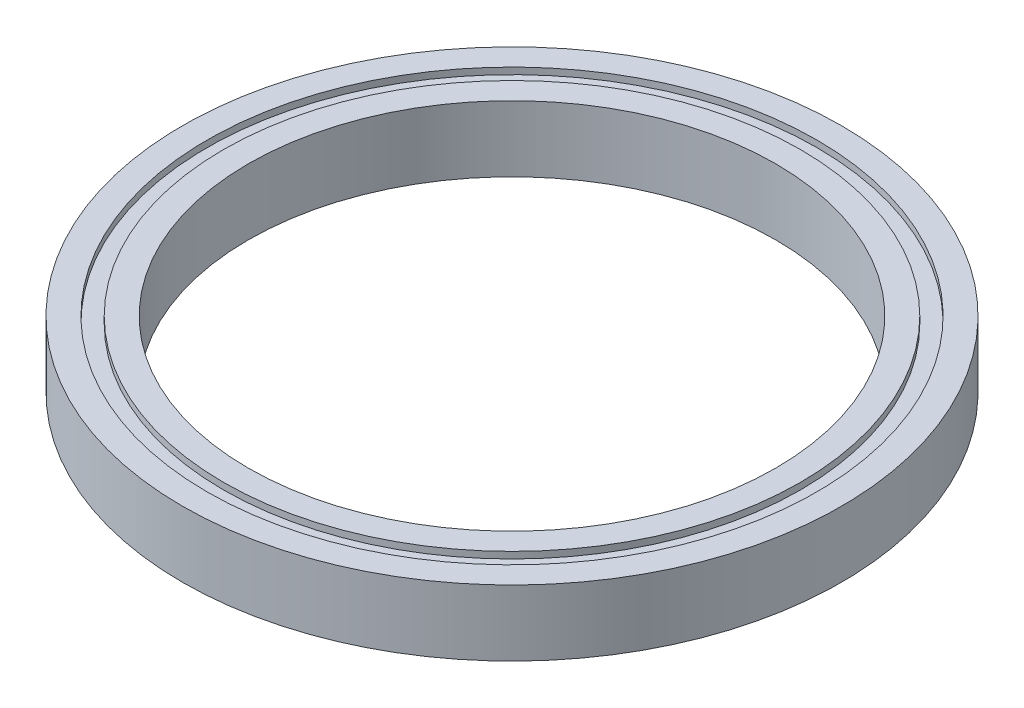
ISO-10303-21;
HEADER;
FILE_DESCRIPTION(('STEP AP214'),'2;1');
FILE_NAME('part.step','',(''),(''),'','','');
FILE_SCHEMA(('AUTOMOTIVE_DESIGN { 1 0 10303 214 1 1 1 1 }'));
ENDSEC;
DATA;
#1=APPLICATION_CONTEXT('core data for automotive mechanical design processes');
#2=APPLICATION_PROTOCOL_DEFINITION('international standard','automotive_design',2000,#1);
#3=PRODUCT_CONTEXT('',#1,'mechanical');
#4=PRODUCT('Part','Part','',(#3));
#5=PRODUCT_RELATED_PRODUCT_CATEGORY('part','',(#4));
#6=PRODUCT_DEFINITION_FORMATION('','',#4);
#7=PRODUCT_DEFINITION_CONTEXT('part definition',#1,'design');
#8=PRODUCT_DEFINITION('design','',#6,#7);
#9=PRODUCT_DEFINITION_SHAPE('','',#8);
#10=(LENGTH_UNIT() NAMED_UNIT(*) SI_UNIT(.MILLI.,.METRE.));
#11=(NAMED_UNIT(*) PLANE_ANGLE_UNIT() SI_UNIT($,.RADIAN.));
#12=(NAMED_UNIT(*) SI_UNIT($,.STERADIAN.) SOLID_ANGLE_UNIT());
#13=UNCERTAINTY_MEASURE_WITH_UNIT(LENGTH_MEASURE(1.E-05),#10,'distance_accuracy_value','');
#14=(GEOMETRIC_REPRESENTATION_CONTEXT(3) GLOBAL_UNCERTAINTY_ASSIGNED_CONTEXT((#13)) GLOBAL_UNIT_ASSIGNED_CONTEXT((#10,
#11,#12)) REPRESENTATION_CONTEXT('',''));
#15=CARTESIAN_POINT('',(0.,0.,0.));
#16=DIRECTION('',(0.,0.,1.));
#17=DIRECTION('',(1.,0.,0.));
#18=AXIS2_PLACEMENT_3D('',#15,#16,#17);
#19=CARTESIAN_POINT('',(0.,0.,0.));
#20=DIRECTION('',(0.,1.,0.));
#21=DIRECTION('',(0.,0.,1.));
#22=AXIS2_PLACEMENT_3D('',#19,#20,#21);
#23=PLANE('',#22);
#24=CARTESIAN_POINT('',(0.,0.,0.));
#25=DIRECTION('',(0.,1.,0.));
#26=DIRECTION('',(0.,0.,1.));
#27=AXIS2_PLACEMENT_3D('',#24,#25,#26);
#28=CIRCLE('',#27,40.);
#29=CARTESIAN_POINT('',(0.,0.,40.));
#30=VERTEX_POINT('',#29);
#31=EDGE_CURVE('E47',#30,#30,#28,.T.);
#32=ORIENTED_EDGE('',*,*,#31,.T.);
#33=EDGE_LOOP('',(#32));
#34=FACE_BOUND('',#33,.T.);
#35=CARTESIAN_POINT('',(0.,0.,0.));
#36=DIRECTION('',(0.,-1.,0.));
#37=DIRECTION('',(0.,0.,-1.));
#38=AXIS2_PLACEMENT_3D('',#35,#36,#37);
#39=CIRCLE('',#38,43.75);
#40=CARTESIAN_POINT('',(0.,0.,-43.75));
#41=VERTEX_POINT('',#40);
#42=EDGE_CURVE('E71',#41,#41,#39,.T.);
#43=ORIENTED_EDGE('',*,*,#42,.T.);
#44=EDGE_LOOP('',(#43));
#45=FACE_BOUND('',#44,.T.);
#46=ADVANCED_FACE('F34',(#34,#45),#23,.F.);
#47=CARTESIAN_POINT('',(0.,10.,0.));
#48=DIRECTION('',(0.,1.,0.));
#49=DIRECTION('',(0.,0.,1.));
#50=AXIS2_PLACEMENT_3D('',#47,#48,#49);
#51=PLANE('',#50);
#52=CARTESIAN_POINT('',(0.,10.,0.));
#53=DIRECTION('',(0.,1.,0.));
#54=DIRECTION('',(0.,0.,1.));
#55=AXIS2_PLACEMENT_3D('',#52,#53,#54);
#56=CIRCLE('',#55,40.);
#57=CARTESIAN_POINT('',(0.,10.,40.));
#58=VERTEX_POINT('',#57);
#59=EDGE_CURVE('E45',#58,#58,#56,.T.);
#60=ORIENTED_EDGE('',*,*,#59,.F.);
#61=EDGE_LOOP('',(#60));
#62=FACE_BOUND('',#61,.T.);
#63=CARTESIAN_POINT('',(0.,10.,0.));
#64=DIRECTION('',(0.,1.,0.));
#65=DIRECTION('',(0.,0.,1.));
#66=AXIS2_PLACEMENT_3D('',#63,#64,#65);
#67=CIRCLE('',#66,43.75);
#68=CARTESIAN_POINT('',(0.,10.,43.75));
#69=VERTEX_POINT('',#68);
#70=EDGE_CURVE('E59',#69,#69,#67,.T.);
#71=ORIENTED_EDGE('',*,*,#70,.T.);
#72=EDGE_LOOP('',(#71));
#73=FACE_BOUND('',#72,.T.);
#74=ADVANCED_FACE('F109',(#62,#73),#51,.T.);
#75=CARTESIAN_POINT('',(0.,10.,0.));
#76=DIRECTION('',(0.,1.,0.));
#77=DIRECTION('',(0.,0.,1.));
#78=AXIS2_PLACEMENT_3D('',#75,#76,#77);
#79=CIRCLE('',#78,46.25);
#80=CARTESIAN_POINT('',(0.,10.,46.25));
#81=VERTEX_POINT('',#80);
#82=EDGE_CURVE('E53',#81,#81,#79,.T.);
#83=ORIENTED_EDGE('',*,*,#82,.F.);
#84=EDGE_LOOP('',(#83));
#85=FACE_BOUND('',#84,.T.);
#86=CARTESIAN_POINT('',(0.,10.,0.));
#87=DIRECTION('',(0.,1.,0.));
#88=DIRECTION('',(0.,0.,1.));
#89=AXIS2_PLACEMENT_3D('',#86,#87,#88);
#90=CIRCLE('',#89,50.);
#91=CARTESIAN_POINT('',(0.,10.,50.));
#92=VERTEX_POINT('',#91);
#93=EDGE_CURVE('E10',#92,#92,#90,.T.);
#94=ORIENTED_EDGE('',*,*,#93,.T.);
#95=EDGE_LOOP('',(#94));
#96=FACE_BOUND('',#95,.T.);
#97=ADVANCED_FACE('F96',(#85,#96),#51,.T.);
#98=CARTESIAN_POINT('',(0.,0.,0.));
#99=DIRECTION('',(0.,-1.,0.));
#100=DIRECTION('',(0.,0.,-1.));
#101=AXIS2_PLACEMENT_3D('',#98,#99,#100);
#102=CIRCLE('',#101,46.25);
#103=CARTESIAN_POINT('',(0.,0.,-46.25));
#104=VERTEX_POINT('',#103);
#105=EDGE_CURVE('E65',#104,#104,#102,.T.);
#106=ORIENTED_EDGE('',*,*,#105,.F.);
#107=EDGE_LOOP('',(#106));
#108=FACE_BOUND('',#107,.T.);
#109=CARTESIAN_POINT('',(0.,0.,0.));
#110=DIRECTION('',(0.,1.,0.));
#111=DIRECTION('',(0.,0.,1.));
#112=AXIS2_PLACEMENT_3D('',#109,#110,#111);
#113=CIRCLE('',#112,50.);
#114=CARTESIAN_POINT('',(0.,0.,50.));
#115=VERTEX_POINT('',#114);
#116=EDGE_CURVE('E38',#115,#115,#113,.T.);
#117=ORIENTED_EDGE('',*,*,#116,.F.);
#118=EDGE_LOOP('',(#117));
#119=FACE_BOUND('',#118,.T.);
#120=ADVANCED_FACE('F93',(#108,#119),#23,.F.);
#121=CARTESIAN_POINT('',(0.,10.,0.));
#122=DIRECTION('',(0.,-1.,0.));
#123=DIRECTION('',(0.,0.,-1.));
#124=AXIS2_PLACEMENT_3D('',#121,#122,#123);
#125=CYLINDRICAL_SURFACE('',#124,50.);
#126=ORIENTED_EDGE('',*,*,#93,.F.);
#127=EDGE_LOOP('',(#126));
#128=FACE_BOUND('',#127,.T.);
#129=ORIENTED_EDGE('',*,*,#116,.T.);
#130=EDGE_LOOP('',(#129));
#131=FACE_BOUND('',#130,.T.);
#132=ADVANCED_FACE('F36',(#128,#131),#125,.T.);
#133=CARTESIAN_POINT('',(0.,10.,0.));
#134=DIRECTION('',(0.,-1.,0.));
#135=DIRECTION('',(0.,0.,-1.));
#136=AXIS2_PLACEMENT_3D('',#133,#134,#135);
#137=CYLINDRICAL_SURFACE('',#136,40.);
#138=ORIENTED_EDGE('',*,*,#59,.T.);
#139=EDGE_LOOP('',(#138));
#140=FACE_BOUND('',#139,.T.);
#141=ORIENTED_EDGE('',*,*,#31,.F.);
#142=EDGE_LOOP('',(#141));
#143=FACE_BOUND('',#142,.T.);
#144=ADVANCED_FACE('F100',(#140,#143),#137,.F.);
#145=CARTESIAN_POINT('',(0.,9.,0.));
#146=DIRECTION('',(0.,1.,0.));
#147=DIRECTION('',(0.,0.,1.));
#148=AXIS2_PLACEMENT_3D('',#145,#146,#147);
#149=CYLINDRICAL_SURFACE('',#148,46.25);
#150=CARTESIAN_POINT('',(0.,9.,0.));
#151=DIRECTION('',(0.,1.,0.));
#152=DIRECTION('',(0.,0.,1.));
#153=AXIS2_PLACEMENT_3D('',#150,#151,#152);
#154=CIRCLE('',#153,46.25);
#155=CARTESIAN_POINT('',(0.,9.,46.25));
#156=VERTEX_POINT('',#155);
#157=EDGE_CURVE('E50',#156,#156,#154,.T.);
#158=ORIENTED_EDGE('',*,*,#157,.F.);
#159=EDGE_LOOP('',(#158));
#160=FACE_BOUND('',#159,.T.);
#161=ORIENTED_EDGE('',*,*,#82,.T.);
#162=EDGE_LOOP('',(#161));
#163=FACE_BOUND('',#162,.T.);
#164=ADVANCED_FACE('F105',(#160,#163),#149,.F.);
#165=CARTESIAN_POINT('',(0.,9.,0.));
#166=DIRECTION('',(0.,1.,0.));
#167=DIRECTION('',(0.,0.,1.));
#168=AXIS2_PLACEMENT_3D('',#165,#166,#167);
#169=PLANE('',#168);
#170=CARTESIAN_POINT('',(0.,9.,0.));
#171=DIRECTION('',(0.,1.,0.));
#172=DIRECTION('',(0.,0.,1.));
#173=AXIS2_PLACEMENT_3D('',#170,#171,#172);
#174=CIRCLE('',#173,43.75);
#175=CARTESIAN_POINT('',(0.,9.,43.75));
#176=VERTEX_POINT('',#175);
#177=EDGE_CURVE('E56',#176,#176,#174,.T.);
#178=ORIENTED_EDGE('',*,*,#177,.F.);
#179=EDGE_LOOP('',(#178));
#180=FACE_BOUND('',#179,.T.);
#181=ORIENTED_EDGE('',*,*,#157,.T.);
#182=EDGE_LOOP('',(#181));
#183=FACE_BOUND('',#182,.T.);
#184=ADVANCED_FACE('F122',(#180,#183),#169,.T.);
#185=CARTESIAN_POINT('',(0.,9.,0.));
#186=DIRECTION('',(0.,1.,0.));
#187=DIRECTION('',(0.,0.,1.));
#188=AXIS2_PLACEMENT_3D('',#185,#186,#187);
#189=CYLINDRICAL_SURFACE('',#188,43.75);
#190=ORIENTED_EDGE('',*,*,#177,.T.);
#191=EDGE_LOOP('',(#190));
#192=FACE_BOUND('',#191,.T.);
#193=ORIENTED_EDGE('',*,*,#70,.F.);
#194=EDGE_LOOP('',(#193));
#195=FACE_BOUND('',#194,.T.);
#196=ADVANCED_FACE('F89',(#192,#195),#189,.T.);
#197=CARTESIAN_POINT('',(0.,1.,0.));
#198=DIRECTION('',(0.,-1.,0.));
#199=DIRECTION('',(0.,0.,-1.));
#200=AXIS2_PLACEMENT_3D('',#197,#198,#199);
#201=CYLINDRICAL_SURFACE('',#200,46.25);
#202=CARTESIAN_POINT('',(0.,1.,0.));
#203=DIRECTION('',(0.,-1.,0.));
#204=DIRECTION('',(0.,0.,-1.));
#205=AXIS2_PLACEMENT_3D('',#202,#203,#204);
#206=CIRCLE('',#205,46.25);
#207=CARTESIAN_POINT('',(0.,1.,-46.25));
#208=VERTEX_POINT('',#207);
#209=EDGE_CURVE('E62',#208,#208,#206,.T.);
#210=ORIENTED_EDGE('',*,*,#209,.F.);
#211=EDGE_LOOP('',(#210));
#212=FACE_BOUND('',#211,.T.);
#213=ORIENTED_EDGE('',*,*,#105,.T.);
#214=EDGE_LOOP('',(#213));
#215=FACE_BOUND('',#214,.T.);
#216=ADVANCED_FACE('F83',(#212,#215),#201,.F.);
#217=CARTESIAN_POINT('',(0.,1.,0.));
#218=DIRECTION('',(0.,-1.,0.));
#219=DIRECTION('',(0.,0.,-1.));
#220=AXIS2_PLACEMENT_3D('',#217,#218,#219);
#221=PLANE('',#220);
#222=CARTESIAN_POINT('',(0.,1.,0.));
#223=DIRECTION('',(0.,-1.,0.));
#224=DIRECTION('',(0.,0.,-1.));
#225=AXIS2_PLACEMENT_3D('',#222,#223,#224);
#226=CIRCLE('',#225,43.75);
#227=CARTESIAN_POINT('',(0.,1.,-43.75));
#228=VERTEX_POINT('',#227);
#229=EDGE_CURVE('E68',#228,#228,#226,.T.);
#230=ORIENTED_EDGE('',*,*,#229,.F.);
#231=EDGE_LOOP('',(#230));
#232=FACE_BOUND('',#231,.T.);
#233=ORIENTED_EDGE('',*,*,#209,.T.);
#234=EDGE_LOOP('',(#233));
#235=FACE_BOUND('',#234,.T.);
#236=ADVANCED_FACE('F80',(#232,#235),#221,.T.);
#237=CARTESIAN_POINT('',(0.,1.,0.));
#238=DIRECTION('',(0.,-1.,0.));
#239=DIRECTION('',(0.,0.,-1.));
#240=AXIS2_PLACEMENT_3D('',#237,#238,#239);
#241=CYLINDRICAL_SURFACE('',#240,43.75);
#242=ORIENTED_EDGE('',*,*,#229,.T.);
#243=EDGE_LOOP('',(#242));
#244=FACE_BOUND('',#243,.T.);
#245=ORIENTED_EDGE('',*,*,#42,.F.);
#246=EDGE_LOOP('',(#245));
#247=FACE_BOUND('',#246,.T.);
#248=ADVANCED_FACE('F77',(#244,#247),#241,.T.);
#249=CLOSED_SHELL('',(#46,#74,#97,#120,#132,#144,#164,#184,#196,#216,#236,#248));
#250=MANIFOLD_SOLID_BREP('B2',#249);
#251=ADVANCED_BREP_SHAPE_REPRESENTATION('',(#18,#250),#14);
#252=SHAPE_DEFINITION_REPRESENTATION(#9,#251);
ENDSEC;
END-ISO-10303-21;
